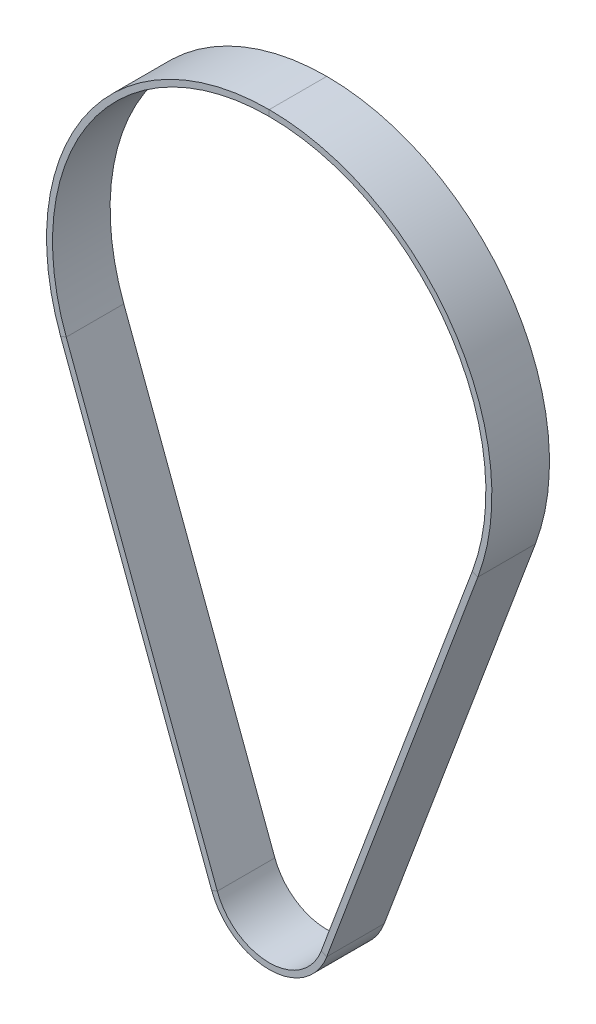
ISO-10303-21;
HEADER;
FILE_DESCRIPTION(('STEP AP214'),'2;1');
FILE_NAME('part.step','',(''),(''),'','','');
FILE_SCHEMA(('AUTOMOTIVE_DESIGN { 1 0 10303 214 1 1 1 1 }'));
ENDSEC;
DATA;
#1=APPLICATION_CONTEXT('core data for automotive mechanical design processes');
#2=APPLICATION_PROTOCOL_DEFINITION('international standard','automotive_design',2000,#1);
#3=PRODUCT_CONTEXT('',#1,'mechanical');
#4=PRODUCT('Part','Part','',(#3));
#5=PRODUCT_RELATED_PRODUCT_CATEGORY('part','',(#4));
#6=PRODUCT_DEFINITION_FORMATION('','',#4);
#7=PRODUCT_DEFINITION_CONTEXT('part definition',#1,'design');
#8=PRODUCT_DEFINITION('design','',#6,#7);
#9=PRODUCT_DEFINITION_SHAPE('','',#8);
#10=(LENGTH_UNIT() NAMED_UNIT(*) SI_UNIT(.MILLI.,.METRE.));
#11=(NAMED_UNIT(*) PLANE_ANGLE_UNIT() SI_UNIT($,.RADIAN.));
#12=(NAMED_UNIT(*) SI_UNIT($,.STERADIAN.) SOLID_ANGLE_UNIT());
#13=UNCERTAINTY_MEASURE_WITH_UNIT(LENGTH_MEASURE(1.E-05),#10,'distance_accuracy_value','');
#14=(GEOMETRIC_REPRESENTATION_CONTEXT(3) GLOBAL_UNCERTAINTY_ASSIGNED_CONTEXT((#13)) GLOBAL_UNIT_ASSIGNED_CONTEXT((#10,
#11,#12)) REPRESENTATION_CONTEXT('',''));
#15=CARTESIAN_POINT('',(0.,0.,0.));
#16=DIRECTION('',(0.,0.,1.));
#17=DIRECTION('',(1.,0.,0.));
#18=AXIS2_PLACEMENT_3D('',#15,#16,#17);
#19=CARTESIAN_POINT('',(0.,0.,0.));
#20=DIRECTION('',(0.,0.,-1.));
#21=DIRECTION('',(-1.,0.,0.));
#22=AXIS2_PLACEMENT_3D('',#19,#20,#21);
#23=CYLINDRICAL_SURFACE('',#22,58.);
#24=CARTESIAN_POINT('',(0.,0.,0.));
#25=DIRECTION('',(0.,0.,-1.));
#26=DIRECTION('',(-0.93674969975976,-0.349999999999999,0.));
#27=AXIS2_PLACEMENT_3D('',#24,#25,#26);
#28=CIRCLE('',#27,58.);
#29=CARTESIAN_POINT('',(-54.3314825860661,-20.3,0.));
#30=VERTEX_POINT('',#29);
#31=CARTESIAN_POINT('',(0.,58.,0.));
#32=VERTEX_POINT('',#31);
#33=EDGE_CURVE('E11',#30,#32,#28,.T.);
#34=ORIENTED_EDGE('',*,*,#33,.F.);
#35=DIRECTION('',(0.,0.,1.));
#36=VECTOR('',#35,1.);
#37=CARTESIAN_POINT('',(-54.3314825860661,-20.3,15.));
#38=LINE('',#37,#36);
#39=CARTESIAN_POINT('',(-54.3314825860661,-20.3,15.));
#40=VERTEX_POINT('',#39);
#41=EDGE_CURVE('E42',#30,#40,#38,.T.);
#42=ORIENTED_EDGE('',*,*,#41,.T.);
#43=CARTESIAN_POINT('',(0.,0.,15.));
#44=DIRECTION('',(0.,0.,-1.));
#45=DIRECTION('',(-0.93674969975976,-0.349999999999999,0.));
#46=AXIS2_PLACEMENT_3D('',#43,#44,#45);
#47=CIRCLE('',#46,58.);
#48=CARTESIAN_POINT('',(0.,58.,15.));
#49=VERTEX_POINT('',#48);
#50=EDGE_CURVE('E130',#40,#49,#47,.T.);
#51=ORIENTED_EDGE('',*,*,#50,.T.);
#52=DIRECTION('',(0.,0.,1.));
#53=VECTOR('',#52,1.);
#54=CARTESIAN_POINT('',(0.,58.,15.));
#55=LINE('',#54,#53);
#56=EDGE_CURVE('E133',#32,#49,#55,.T.);
#57=ORIENTED_EDGE('',*,*,#56,.F.);
#58=EDGE_LOOP('',(#34,#42,#51,#57));
#59=FACE_BOUND('',#58,.T.);
#60=ADVANCED_FACE('F39',(#59),#23,.T.);
#61=CARTESIAN_POINT('',(-54.3314825860661,-20.3,0.));
#62=DIRECTION('',(0.,0.,-1.));
#63=DIRECTION('',(-1.,0.,0.));
#64=AXIS2_PLACEMENT_3D('',#61,#62,#63);
#65=PLANE('',#64);
#66=CARTESIAN_POINT('',(0.,0.,0.));
#67=DIRECTION('',(0.,0.,-1.));
#68=DIRECTION('',(-0.93674969975976,-0.349999999999999,0.));
#69=AXIS2_PLACEMENT_3D('',#66,#67,#68);
#70=CIRCLE('',#69,56.44);
#71=CARTESIAN_POINT('',(-52.8701530544408,-19.754,0.));
#72=VERTEX_POINT('',#71);
#73=CARTESIAN_POINT('',(0.,56.44,0.));
#74=VERTEX_POINT('',#73);
#75=EDGE_CURVE('E47',#72,#74,#70,.T.);
#76=ORIENTED_EDGE('',*,*,#75,.F.);
#77=DIRECTION('',(-0.93674969975976,-0.35,0.));
#78=VECTOR('',#77,1.);
#79=CARTESIAN_POINT('',(-54.3314825860661,-20.3,0.));
#80=LINE('',#79,#78);
#81=EDGE_CURVE('E220',#72,#30,#80,.T.);
#82=ORIENTED_EDGE('',*,*,#81,.T.);
#83=ORIENTED_EDGE('',*,*,#33,.T.);
#84=DIRECTION('',(0.,1.,0.));
#85=VECTOR('',#84,1.);
#86=CARTESIAN_POINT('',(0.,58.,0.));
#87=LINE('',#86,#85);
#88=EDGE_CURVE('E158',#74,#32,#87,.T.);
#89=ORIENTED_EDGE('',*,*,#88,.F.);
#90=EDGE_LOOP('',(#76,#82,#83,#89));
#91=FACE_BOUND('',#90,.T.);
#92=ADVANCED_FACE('F267',(#91),#65,.T.);
#93=CARTESIAN_POINT('',(0.,0.,0.));
#94=DIRECTION('',(0.,0.,-1.));
#95=DIRECTION('',(-1.,0.,0.));
#96=AXIS2_PLACEMENT_3D('',#93,#94,#95);
#97=CYLINDRICAL_SURFACE('',#96,56.44);
#98=CARTESIAN_POINT('',(0.,0.,15.));
#99=DIRECTION('',(0.,0.,-1.));
#100=DIRECTION('',(-0.93674969975976,-0.349999999999999,0.));
#101=AXIS2_PLACEMENT_3D('',#98,#99,#100);
#102=CIRCLE('',#101,56.44);
#103=CARTESIAN_POINT('',(-52.8701530544408,-19.754,15.));
#104=VERTEX_POINT('',#103);
#105=CARTESIAN_POINT('',(0.,56.44,15.));
#106=VERTEX_POINT('',#105);
#107=EDGE_CURVE('E139',#104,#106,#102,.T.);
#108=ORIENTED_EDGE('',*,*,#107,.F.);
#109=DIRECTION('',(0.,0.,-1.));
#110=VECTOR('',#109,1.);
#111=CARTESIAN_POINT('',(-52.8701530544408,-19.754,15.));
#112=LINE('',#111,#110);
#113=EDGE_CURVE('E195',#104,#72,#112,.T.);
#114=ORIENTED_EDGE('',*,*,#113,.T.);
#115=ORIENTED_EDGE('',*,*,#75,.T.);
#116=DIRECTION('',(0.,0.,-1.));
#117=VECTOR('',#116,1.);
#118=CARTESIAN_POINT('',(0.,56.44,15.));
#119=LINE('',#118,#117);
#120=EDGE_CURVE('E162',#106,#74,#119,.T.);
#121=ORIENTED_EDGE('',*,*,#120,.F.);
#122=EDGE_LOOP('',(#108,#114,#115,#121));
#123=FACE_BOUND('',#122,.T.);
#124=ADVANCED_FACE('F271',(#123),#97,.F.);
#125=CARTESIAN_POINT('',(-14.9879951961561,-125.6,15.));
#126=DIRECTION('',(-0.93674969975976,-0.35,0.));
#127=DIRECTION('',(0.35,-0.93674969975976,0.));
#128=AXIS2_PLACEMENT_3D('',#125,#126,#127);
#129=PLANE('',#128);
#130=ORIENTED_EDGE('',*,*,#41,.F.);
#131=DIRECTION('',(-0.35,0.93674969975976,0.));
#132=VECTOR('',#131,1.);
#133=CARTESIAN_POINT('',(-14.9879951961561,-125.6,0.));
#134=LINE('',#133,#132);
#135=CARTESIAN_POINT('',(-14.9879951961561,-125.6,0.));
#136=VERTEX_POINT('',#135);
#137=EDGE_CURVE('E234',#136,#30,#134,.T.);
#138=ORIENTED_EDGE('',*,*,#137,.F.);
#139=DIRECTION('',(0.,0.,1.));
#140=VECTOR('',#139,1.);
#141=CARTESIAN_POINT('',(-14.9879951961562,-125.6,15.));
#142=LINE('',#141,#140);
#143=CARTESIAN_POINT('',(-14.9879951961561,-125.6,15.));
#144=VERTEX_POINT('',#143);
#145=EDGE_CURVE('E198',#136,#144,#142,.T.);
#146=ORIENTED_EDGE('',*,*,#145,.T.);
#147=DIRECTION('',(-0.35,0.93674969975976,0.));
#148=VECTOR('',#147,1.);
#149=CARTESIAN_POINT('',(-14.9879951961561,-125.6,15.));
#150=LINE('',#149,#148);
#151=EDGE_CURVE('E192',#144,#40,#150,.T.);
#152=ORIENTED_EDGE('',*,*,#151,.T.);
#153=EDGE_LOOP('',(#130,#138,#146,#152));
#154=FACE_BOUND('',#153,.T.);
#155=ADVANCED_FACE('F243',(#154),#129,.T.);
#156=CARTESIAN_POINT('',(-14.9879951961561,-125.6,0.));
#157=DIRECTION('',(0.,0.,-1.));
#158=DIRECTION('',(-1.,0.,0.));
#159=AXIS2_PLACEMENT_3D('',#156,#157,#158);
#160=PLANE('',#159);
#161=ORIENTED_EDGE('',*,*,#137,.T.);
#162=ORIENTED_EDGE('',*,*,#81,.F.);
#163=DIRECTION('',(-0.35,0.93674969975976,0.));
#164=VECTOR('',#163,1.);
#165=CARTESIAN_POINT('',(-13.5266656645309,-125.054,0.));
#166=LINE('',#165,#164);
#167=CARTESIAN_POINT('',(-13.5266656645309,-125.054,0.));
#168=VERTEX_POINT('',#167);
#169=EDGE_CURVE('E217',#168,#72,#166,.T.);
#170=ORIENTED_EDGE('',*,*,#169,.F.);
#171=DIRECTION('',(-0.93674969975976,-0.35,0.));
#172=VECTOR('',#171,1.);
#173=CARTESIAN_POINT('',(-14.9879951961562,-125.6,0.));
#174=LINE('',#173,#172);
#175=EDGE_CURVE('E213',#168,#136,#174,.T.);
#176=ORIENTED_EDGE('',*,*,#175,.T.);
#177=EDGE_LOOP('',(#161,#162,#170,#176));
#178=FACE_BOUND('',#177,.T.);
#179=ADVANCED_FACE('F280',(#178),#160,.T.);
#180=CARTESIAN_POINT('',(-13.5266656645309,-125.054,15.));
#181=DIRECTION('',(0.93674969975976,0.35,0.));
#182=DIRECTION('',(-0.35,0.93674969975976,0.));
#183=AXIS2_PLACEMENT_3D('',#180,#181,#182);
#184=PLANE('',#183);
#185=ORIENTED_EDGE('',*,*,#169,.T.);
#186=ORIENTED_EDGE('',*,*,#113,.F.);
#187=DIRECTION('',(-0.35,0.93674969975976,0.));
#188=VECTOR('',#187,1.);
#189=CARTESIAN_POINT('',(-13.5266656645309,-125.054,15.));
#190=LINE('',#189,#188);
#191=CARTESIAN_POINT('',(-13.5266656645309,-125.054,15.));
#192=VERTEX_POINT('',#191);
#193=EDGE_CURVE('E191',#192,#104,#190,.T.);
#194=ORIENTED_EDGE('',*,*,#193,.F.);
#195=DIRECTION('',(0.,0.,-1.));
#196=VECTOR('',#195,1.);
#197=CARTESIAN_POINT('',(-13.5266656645309,-125.054,15.));
#198=LINE('',#197,#196);
#199=EDGE_CURVE('E184',#192,#168,#198,.T.);
#200=ORIENTED_EDGE('',*,*,#199,.T.);
#201=EDGE_LOOP('',(#185,#186,#194,#200));
#202=FACE_BOUND('',#201,.T.);
#203=ADVANCED_FACE('F251',(#202),#184,.T.);
#204=CARTESIAN_POINT('',(-14.9879951961561,-125.6,15.));
#205=DIRECTION('',(0.,0.,1.));
#206=DIRECTION('',(1.,0.,0.));
#207=AXIS2_PLACEMENT_3D('',#204,#205,#206);
#208=PLANE('',#207);
#209=ORIENTED_EDGE('',*,*,#193,.T.);
#210=DIRECTION('',(0.93674969975976,0.35,0.));
#211=VECTOR('',#210,1.);
#212=CARTESIAN_POINT('',(-54.3314825860661,-20.3,15.));
#213=LINE('',#212,#211);
#214=EDGE_CURVE('E189',#40,#104,#213,.T.);
#215=ORIENTED_EDGE('',*,*,#214,.F.);
#216=ORIENTED_EDGE('',*,*,#151,.F.);
#217=DIRECTION('',(0.93674969975976,0.35,0.));
#218=VECTOR('',#217,1.);
#219=CARTESIAN_POINT('',(-14.9879951961562,-125.6,15.));
#220=LINE('',#219,#218);
#221=EDGE_CURVE('E181',#144,#192,#220,.T.);
#222=ORIENTED_EDGE('',*,*,#221,.T.);
#223=EDGE_LOOP('',(#209,#215,#216,#222));
#224=FACE_BOUND('',#223,.T.);
#225=ADVANCED_FACE('F248',(#224),#208,.T.);
#226=CARTESIAN_POINT('',(0.,-120.,0.));
#227=DIRECTION('',(0.,0.,-1.));
#228=DIRECTION('',(-1.,0.,0.));
#229=AXIS2_PLACEMENT_3D('',#226,#227,#228);
#230=CYLINDRICAL_SURFACE('',#229,16.);
#231=ORIENTED_EDGE('',*,*,#145,.F.);
#232=CARTESIAN_POINT('',(0.,-120.,0.));
#233=DIRECTION('',(0.,0.,-1.));
#234=DIRECTION('',(0.93674969975976,-0.35,0.));
#235=AXIS2_PLACEMENT_3D('',#232,#233,#234);
#236=CIRCLE('',#235,16.);
#237=CARTESIAN_POINT('',(14.9879951961561,-125.6,0.));
#238=VERTEX_POINT('',#237);
#239=EDGE_CURVE('E88',#238,#136,#236,.T.);
#240=ORIENTED_EDGE('',*,*,#239,.F.);
#241=DIRECTION('',(0.,0.,1.));
#242=VECTOR('',#241,1.);
#243=CARTESIAN_POINT('',(14.9879951961561,-125.6,15.));
#244=LINE('',#243,#242);
#245=CARTESIAN_POINT('',(14.9879951961561,-125.6,15.));
#246=VERTEX_POINT('',#245);
#247=EDGE_CURVE('E188',#238,#246,#244,.T.);
#248=ORIENTED_EDGE('',*,*,#247,.T.);
#249=CARTESIAN_POINT('',(0.,-120.,15.));
#250=DIRECTION('',(0.,0.,-1.));
#251=DIRECTION('',(0.93674969975976,-0.35,0.));
#252=AXIS2_PLACEMENT_3D('',#249,#250,#251);
#253=CIRCLE('',#252,16.);
#254=EDGE_CURVE('E186',#246,#144,#253,.T.);
#255=ORIENTED_EDGE('',*,*,#254,.T.);
#256=EDGE_LOOP('',(#231,#240,#248,#255));
#257=FACE_BOUND('',#256,.T.);
#258=ADVANCED_FACE('F262',(#257),#230,.T.);
#259=CARTESIAN_POINT('',(14.9879951961561,-125.6,0.));
#260=DIRECTION('',(0.,0.,-1.));
#261=DIRECTION('',(-1.,0.,0.));
#262=AXIS2_PLACEMENT_3D('',#259,#260,#261);
#263=PLANE('',#262);
#264=ORIENTED_EDGE('',*,*,#239,.T.);
#265=ORIENTED_EDGE('',*,*,#175,.F.);
#266=CARTESIAN_POINT('',(0.,-120.,0.));
#267=DIRECTION('',(0.,0.,-1.));
#268=DIRECTION('',(0.93674969975976,-0.35,0.));
#269=AXIS2_PLACEMENT_3D('',#266,#267,#268);
#270=CIRCLE('',#269,14.44);
#271=CARTESIAN_POINT('',(13.5266656645309,-125.054,0.));
#272=VERTEX_POINT('',#271);
#273=EDGE_CURVE('E98',#272,#168,#270,.T.);
#274=ORIENTED_EDGE('',*,*,#273,.F.);
#275=DIRECTION('',(0.93674969975976,-0.35,0.));
#276=VECTOR('',#275,1.);
#277=CARTESIAN_POINT('',(14.9879951961561,-125.6,0.));
#278=LINE('',#277,#276);
#279=EDGE_CURVE('E210',#272,#238,#278,.T.);
#280=ORIENTED_EDGE('',*,*,#279,.T.);
#281=EDGE_LOOP('',(#264,#265,#274,#280));
#282=FACE_BOUND('',#281,.T.);
#283=ADVANCED_FACE('F254',(#282),#263,.T.);
#284=CARTESIAN_POINT('',(0.,-120.,0.));
#285=DIRECTION('',(0.,0.,-1.));
#286=DIRECTION('',(-1.,0.,0.));
#287=AXIS2_PLACEMENT_3D('',#284,#285,#286);
#288=CYLINDRICAL_SURFACE('',#287,14.44);
#289=ORIENTED_EDGE('',*,*,#273,.T.);
#290=ORIENTED_EDGE('',*,*,#199,.F.);
#291=CARTESIAN_POINT('',(0.,-120.,15.));
#292=DIRECTION('',(0.,0.,-1.));
#293=DIRECTION('',(0.93674969975976,-0.35,0.));
#294=AXIS2_PLACEMENT_3D('',#291,#292,#293);
#295=CIRCLE('',#294,14.44);
#296=CARTESIAN_POINT('',(13.5266656645309,-125.054,15.));
#297=VERTEX_POINT('',#296);
#298=EDGE_CURVE('E106',#297,#192,#295,.T.);
#299=ORIENTED_EDGE('',*,*,#298,.F.);
#300=DIRECTION('',(0.,0.,-1.));
#301=VECTOR('',#300,1.);
#302=CARTESIAN_POINT('',(13.5266656645309,-125.054,15.));
#303=LINE('',#302,#301);
#304=EDGE_CURVE('E177',#297,#272,#303,.T.);
#305=ORIENTED_EDGE('',*,*,#304,.T.);
#306=EDGE_LOOP('',(#289,#290,#299,#305));
#307=FACE_BOUND('',#306,.T.);
#308=ADVANCED_FACE('F252',(#307),#288,.F.);
#309=CARTESIAN_POINT('',(14.9879951961561,-125.6,15.));
#310=DIRECTION('',(0.,0.,1.));
#311=DIRECTION('',(1.,0.,0.));
#312=AXIS2_PLACEMENT_3D('',#309,#310,#311);
#313=PLANE('',#312);
#314=ORIENTED_EDGE('',*,*,#298,.T.);
#315=ORIENTED_EDGE('',*,*,#221,.F.);
#316=ORIENTED_EDGE('',*,*,#254,.F.);
#317=DIRECTION('',(-0.93674969975976,0.35,0.));
#318=VECTOR('',#317,1.);
#319=CARTESIAN_POINT('',(14.9879951961561,-125.6,15.));
#320=LINE('',#319,#318);
#321=EDGE_CURVE('E171',#246,#297,#320,.T.);
#322=ORIENTED_EDGE('',*,*,#321,.T.);
#323=EDGE_LOOP('',(#314,#315,#316,#322));
#324=FACE_BOUND('',#323,.T.);
#325=ADVANCED_FACE('F246',(#324),#313,.T.);
#326=CARTESIAN_POINT('',(54.3314825860661,-20.3,15.));
#327=DIRECTION('',(0.93674969975976,-0.35,0.));
#328=DIRECTION('',(0.35,0.93674969975976,0.));
#329=AXIS2_PLACEMENT_3D('',#326,#327,#328);
#330=PLANE('',#329);
#331=ORIENTED_EDGE('',*,*,#247,.F.);
#332=DIRECTION('',(-0.35,-0.93674969975976,0.));
#333=VECTOR('',#332,1.);
#334=CARTESIAN_POINT('',(54.3314825860661,-20.3,0.));
#335=LINE('',#334,#333);
#336=CARTESIAN_POINT('',(54.3314825860661,-20.3,0.));
#337=VERTEX_POINT('',#336);
#338=EDGE_CURVE('E227',#337,#238,#335,.T.);
#339=ORIENTED_EDGE('',*,*,#338,.F.);
#340=DIRECTION('',(0.,0.,1.));
#341=VECTOR('',#340,1.);
#342=CARTESIAN_POINT('',(54.3314825860661,-20.3,15.));
#343=LINE('',#342,#341);
#344=CARTESIAN_POINT('',(54.3314825860661,-20.3,15.));
#345=VERTEX_POINT('',#344);
#346=EDGE_CURVE('E180',#337,#345,#343,.T.);
#347=ORIENTED_EDGE('',*,*,#346,.T.);
#348=DIRECTION('',(-0.35,-0.93674969975976,0.));
#349=VECTOR('',#348,1.);
#350=CARTESIAN_POINT('',(54.3314825860661,-20.3,15.));
#351=LINE('',#350,#349);
#352=EDGE_CURVE('E174',#345,#246,#351,.T.);
#353=ORIENTED_EDGE('',*,*,#352,.T.);
#354=EDGE_LOOP('',(#331,#339,#347,#353));
#355=FACE_BOUND('',#354,.T.);
#356=ADVANCED_FACE('F260',(#355),#330,.T.);
#357=CARTESIAN_POINT('',(54.3314825860661,-20.3,0.));
#358=DIRECTION('',(0.,0.,-1.));
#359=DIRECTION('',(-1.,0.,0.));
#360=AXIS2_PLACEMENT_3D('',#357,#358,#359);
#361=PLANE('',#360);
#362=ORIENTED_EDGE('',*,*,#338,.T.);
#363=ORIENTED_EDGE('',*,*,#279,.F.);
#364=DIRECTION('',(-0.35,-0.93674969975976,0.));
#365=VECTOR('',#364,1.);
#366=CARTESIAN_POINT('',(52.8701530544408,-19.754,0.));
#367=LINE('',#366,#365);
#368=CARTESIAN_POINT('',(52.8701530544408,-19.754,0.));
#369=VERTEX_POINT('',#368);
#370=EDGE_CURVE('E207',#369,#272,#367,.T.);
#371=ORIENTED_EDGE('',*,*,#370,.F.);
#372=DIRECTION('',(0.93674969975976,-0.35,0.));
#373=VECTOR('',#372,1.);
#374=CARTESIAN_POINT('',(54.3314825860661,-20.3,0.));
#375=LINE('',#374,#373);
#376=EDGE_CURVE('E205',#369,#337,#375,.T.);
#377=ORIENTED_EDGE('',*,*,#376,.T.);
#378=EDGE_LOOP('',(#362,#363,#371,#377));
#379=FACE_BOUND('',#378,.T.);
#380=ADVANCED_FACE('F287',(#379),#361,.T.);
#381=CARTESIAN_POINT('',(52.8701530544408,-19.754,15.));
#382=DIRECTION('',(-0.93674969975976,0.35,0.));
#383=DIRECTION('',(-0.35,-0.93674969975976,0.));
#384=AXIS2_PLACEMENT_3D('',#381,#382,#383);
#385=PLANE('',#384);
#386=ORIENTED_EDGE('',*,*,#370,.T.);
#387=ORIENTED_EDGE('',*,*,#304,.F.);
#388=DIRECTION('',(-0.35,-0.93674969975976,0.));
#389=VECTOR('',#388,1.);
#390=CARTESIAN_POINT('',(52.8701530544408,-19.754,15.));
#391=LINE('',#390,#389);
#392=CARTESIAN_POINT('',(52.8701530544408,-19.754,15.));
#393=VERTEX_POINT('',#392);
#394=EDGE_CURVE('E173',#393,#297,#391,.T.);
#395=ORIENTED_EDGE('',*,*,#394,.F.);
#396=DIRECTION('',(0.,0.,-1.));
#397=VECTOR('',#396,1.);
#398=CARTESIAN_POINT('',(52.8701530544408,-19.754,15.));
#399=LINE('',#398,#397);
#400=EDGE_CURVE('E169',#393,#369,#399,.T.);
#401=ORIENTED_EDGE('',*,*,#400,.T.);
#402=EDGE_LOOP('',(#386,#387,#395,#401));
#403=FACE_BOUND('',#402,.T.);
#404=ADVANCED_FACE('F307',(#403),#385,.T.);
#405=CARTESIAN_POINT('',(54.3314825860661,-20.3,15.));
#406=DIRECTION('',(0.,0.,1.));
#407=DIRECTION('',(1.,0.,0.));
#408=AXIS2_PLACEMENT_3D('',#405,#406,#407);
#409=PLANE('',#408);
#410=ORIENTED_EDGE('',*,*,#394,.T.);
#411=ORIENTED_EDGE('',*,*,#321,.F.);
#412=ORIENTED_EDGE('',*,*,#352,.F.);
#413=DIRECTION('',(-0.93674969975976,0.35,0.));
#414=VECTOR('',#413,1.);
#415=CARTESIAN_POINT('',(54.3314825860661,-20.3,15.));
#416=LINE('',#415,#414);
#417=EDGE_CURVE('E150',#345,#393,#416,.T.);
#418=ORIENTED_EDGE('',*,*,#417,.T.);
#419=EDGE_LOOP('',(#410,#411,#412,#418));
#420=FACE_BOUND('',#419,.T.);
#421=ADVANCED_FACE('F284',(#420),#409,.T.);
#422=CARTESIAN_POINT('',(0.,0.,0.));
#423=DIRECTION('',(0.,0.,-1.));
#424=DIRECTION('',(-1.,0.,0.));
#425=AXIS2_PLACEMENT_3D('',#422,#423,#424);
#426=CYLINDRICAL_SURFACE('',#425,58.);
#427=ORIENTED_EDGE('',*,*,#346,.F.);
#428=CARTESIAN_POINT('',(0.,0.,0.));
#429=DIRECTION('',(0.,0.,-1.));
#430=DIRECTION('',(0.,1.,0.));
#431=AXIS2_PLACEMENT_3D('',#428,#429,#430);
#432=CIRCLE('',#431,58.);
#433=EDGE_CURVE('E157',#32,#337,#432,.T.);
#434=ORIENTED_EDGE('',*,*,#433,.F.);
#435=ORIENTED_EDGE('',*,*,#56,.T.);
#436=CARTESIAN_POINT('',(0.,0.,15.));
#437=DIRECTION('',(0.,0.,-1.));
#438=DIRECTION('',(0.,1.,0.));
#439=AXIS2_PLACEMENT_3D('',#436,#437,#438);
#440=CIRCLE('',#439,58.);
#441=EDGE_CURVE('E145',#49,#345,#440,.T.);
#442=ORIENTED_EDGE('',*,*,#441,.T.);
#443=EDGE_LOOP('',(#427,#434,#435,#442));
#444=FACE_BOUND('',#443,.T.);
#445=ADVANCED_FACE('F155',(#444),#426,.T.);
#446=CARTESIAN_POINT('',(0.,58.,0.));
#447=DIRECTION('',(0.,0.,-1.));
#448=DIRECTION('',(-1.,0.,0.));
#449=AXIS2_PLACEMENT_3D('',#446,#447,#448);
#450=PLANE('',#449);
#451=ORIENTED_EDGE('',*,*,#433,.T.);
#452=ORIENTED_EDGE('',*,*,#376,.F.);
#453=CARTESIAN_POINT('',(0.,0.,0.));
#454=DIRECTION('',(0.,0.,-1.));
#455=DIRECTION('',(0.,1.,0.));
#456=AXIS2_PLACEMENT_3D('',#453,#454,#455);
#457=CIRCLE('',#456,56.44);
#458=EDGE_CURVE('E202',#74,#369,#457,.T.);
#459=ORIENTED_EDGE('',*,*,#458,.F.);
#460=ORIENTED_EDGE('',*,*,#88,.T.);
#461=EDGE_LOOP('',(#451,#452,#459,#460));
#462=FACE_BOUND('',#461,.T.);
#463=ADVANCED_FACE('F283',(#462),#450,.T.);
#464=CARTESIAN_POINT('',(0.,0.,0.));
#465=DIRECTION('',(0.,0.,-1.));
#466=DIRECTION('',(-1.,0.,0.));
#467=AXIS2_PLACEMENT_3D('',#464,#465,#466);
#468=CYLINDRICAL_SURFACE('',#467,56.44);
#469=ORIENTED_EDGE('',*,*,#458,.T.);
#470=ORIENTED_EDGE('',*,*,#400,.F.);
#471=CARTESIAN_POINT('',(0.,0.,15.));
#472=DIRECTION('',(0.,0.,-1.));
#473=DIRECTION('',(0.,1.,0.));
#474=AXIS2_PLACEMENT_3D('',#471,#472,#473);
#475=CIRCLE('',#474,56.44);
#476=EDGE_CURVE('E168',#106,#393,#475,.T.);
#477=ORIENTED_EDGE('',*,*,#476,.F.);
#478=ORIENTED_EDGE('',*,*,#120,.T.);
#479=EDGE_LOOP('',(#469,#470,#477,#478));
#480=FACE_BOUND('',#479,.T.);
#481=ADVANCED_FACE('F302',(#480),#468,.F.);
#482=CARTESIAN_POINT('',(0.,58.,15.));
#483=DIRECTION('',(0.,0.,1.));
#484=DIRECTION('',(1.,0.,0.));
#485=AXIS2_PLACEMENT_3D('',#482,#483,#484);
#486=PLANE('',#485);
#487=ORIENTED_EDGE('',*,*,#476,.T.);
#488=ORIENTED_EDGE('',*,*,#417,.F.);
#489=ORIENTED_EDGE('',*,*,#441,.F.);
#490=DIRECTION('',(0.,-1.,0.));
#491=VECTOR('',#490,1.);
#492=CARTESIAN_POINT('',(0.,58.,15.));
#493=LINE('',#492,#491);
#494=EDGE_CURVE('E148',#49,#106,#493,.T.);
#495=ORIENTED_EDGE('',*,*,#494,.T.);
#496=EDGE_LOOP('',(#487,#488,#489,#495));
#497=FACE_BOUND('',#496,.T.);
#498=ADVANCED_FACE('F147',(#497),#486,.T.);
#499=CARTESIAN_POINT('',(-54.3314825860661,-20.3,15.));
#500=DIRECTION('',(0.,0.,1.));
#501=DIRECTION('',(1.,0.,0.));
#502=AXIS2_PLACEMENT_3D('',#499,#500,#501);
#503=PLANE('',#502);
#504=ORIENTED_EDGE('',*,*,#214,.T.);
#505=ORIENTED_EDGE('',*,*,#107,.T.);
#506=ORIENTED_EDGE('',*,*,#494,.F.);
#507=ORIENTED_EDGE('',*,*,#50,.F.);
#508=EDGE_LOOP('',(#504,#505,#506,#507));
#509=FACE_BOUND('',#508,.T.);
#510=ADVANCED_FACE('F160',(#509),#503,.T.);
#511=CLOSED_SHELL('',(#60,#92,#124,#155,#179,#203,#225,#258,#283,#308,#325,#356,#380,#404,#421,
#445,#463,#481,#498,#510));
#512=MANIFOLD_SOLID_BREP('B2',#511);
#513=ADVANCED_BREP_SHAPE_REPRESENTATION('',(#18,#512),#14);
#514=SHAPE_DEFINITION_REPRESENTATION(#9,#513);
ENDSEC;
END-ISO-10303-21;
